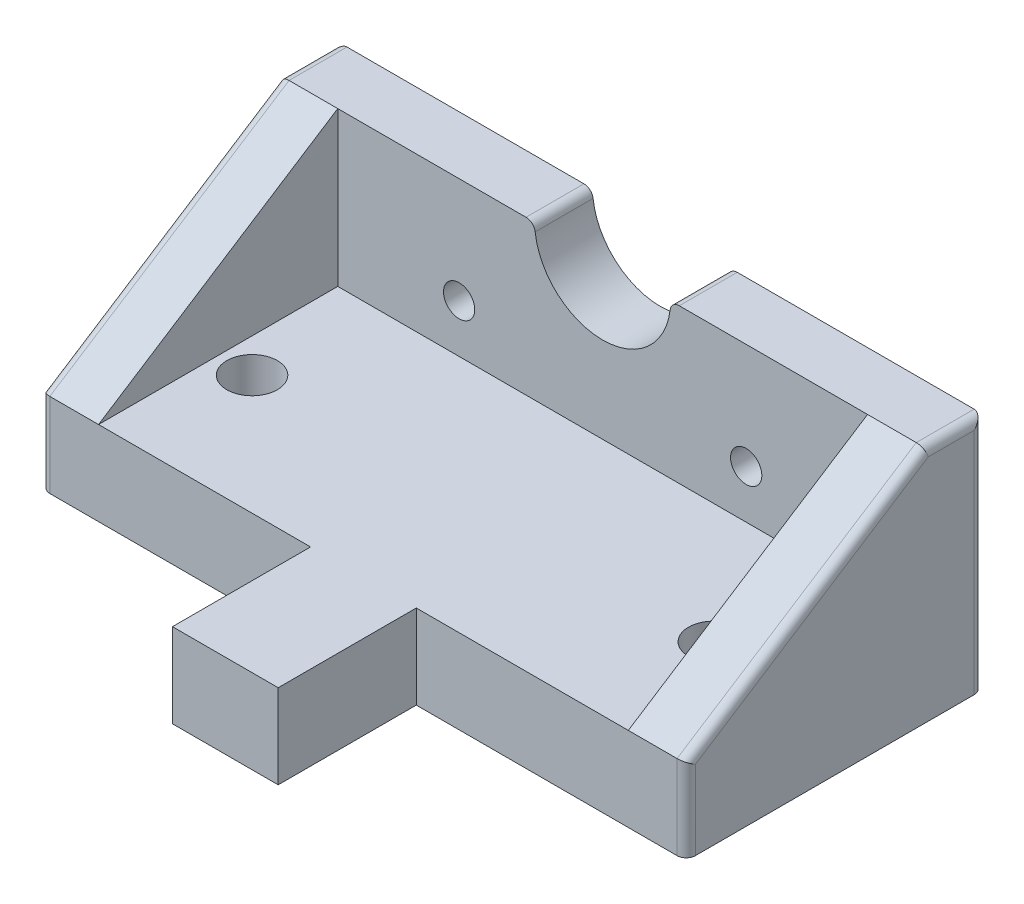
ISO-10303-21;
HEADER;
FILE_DESCRIPTION(('STEP AP214'),'2;1');
FILE_NAME('part.step','',(''),(''),'','','');
FILE_SCHEMA(('AUTOMOTIVE_DESIGN { 1 0 10303 214 1 1 1 1 }'));
ENDSEC;
DATA;
#1=APPLICATION_CONTEXT('core data for automotive mechanical design processes');
#2=APPLICATION_PROTOCOL_DEFINITION('international standard','automotive_design',2000,#1);
#3=PRODUCT_CONTEXT('',#1,'mechanical');
#4=PRODUCT('Part','Part','',(#3));
#5=PRODUCT_RELATED_PRODUCT_CATEGORY('part','',(#4));
#6=PRODUCT_DEFINITION_FORMATION('','',#4);
#7=PRODUCT_DEFINITION_CONTEXT('part definition',#1,'design');
#8=PRODUCT_DEFINITION('design','',#6,#7);
#9=PRODUCT_DEFINITION_SHAPE('','',#8);
#10=(LENGTH_UNIT() NAMED_UNIT(*) SI_UNIT(.MILLI.,.METRE.));
#11=(NAMED_UNIT(*) PLANE_ANGLE_UNIT() SI_UNIT($,.RADIAN.));
#12=(NAMED_UNIT(*) SI_UNIT($,.STERADIAN.) SOLID_ANGLE_UNIT());
#13=UNCERTAINTY_MEASURE_WITH_UNIT(LENGTH_MEASURE(1.E-05),#10,'distance_accuracy_value','');
#14=(GEOMETRIC_REPRESENTATION_CONTEXT(3) GLOBAL_UNCERTAINTY_ASSIGNED_CONTEXT((#13)) GLOBAL_UNIT_ASSIGNED_CONTEXT((#10,
#11,#12)) REPRESENTATION_CONTEXT('',''));
#15=CARTESIAN_POINT('',(0.,0.,0.));
#16=DIRECTION('',(0.,0.,1.));
#17=DIRECTION('',(1.,0.,0.));
#18=AXIS2_PLACEMENT_3D('',#15,#16,#17);
#19=CARTESIAN_POINT('',(-35.11,12.95,-47.34));
#20=DIRECTION('',(0.,1.,0.));
#21=DIRECTION('',(0.,0.,1.));
#22=AXIS2_PLACEMENT_3D('',#19,#20,#21);
#23=PLANE('',#22);
#24=DIRECTION('',(-1.,0.,0.));
#25=VECTOR('',#24,1.);
#26=CARTESIAN_POINT('',(-35.11,12.95,-47.34));
#27=LINE('',#26,#25);
#28=CARTESIAN_POINT('',(34.11,12.95,-47.34));
#29=VERTEX_POINT('',#28);
#30=CARTESIAN_POINT('',(8.33567625559448,12.95,-47.34));
#31=VERTEX_POINT('',#30);
#32=EDGE_CURVE('E255',#29,#31,#27,.T.);
#33=ORIENTED_EDGE('',*,*,#32,.T.);
#34=DIRECTION('',(0.,0.,-1.));
#35=VECTOR('',#34,1.);
#36=CARTESIAN_POINT('',(8.33567625559448,12.95,-47.34));
#37=LINE('',#36,#35);
#38=CARTESIAN_POINT('',(8.33567625559448,12.95,-41.04));
#39=VERTEX_POINT('',#38);
#40=EDGE_CURVE('E316',#31,#39,#37,.F.);
#41=ORIENTED_EDGE('',*,*,#40,.T.);
#42=DIRECTION('',(-1.,0.,0.));
#43=VECTOR('',#42,1.);
#44=CARTESIAN_POINT('',(-28.81,12.95,-41.04));
#45=LINE('',#44,#43);
#46=CARTESIAN_POINT('',(28.81,12.95,-41.04));
#47=VERTEX_POINT('',#46);
#48=EDGE_CURVE('E218',#47,#39,#45,.T.);
#49=ORIENTED_EDGE('',*,*,#48,.F.);
#50=DIRECTION('',(1.,0.,0.));
#51=VECTOR('',#50,1.);
#52=CARTESIAN_POINT('',(-35.11,12.95,-41.04));
#53=LINE('',#52,#51);
#54=CARTESIAN_POINT('',(34.11,12.95,-41.04));
#55=VERTEX_POINT('',#54);
#56=EDGE_CURVE('E183',#47,#55,#53,.T.);
#57=ORIENTED_EDGE('',*,*,#56,.T.);
#58=DIRECTION('',(0.,0.,1.));
#59=VECTOR('',#58,1.);
#60=CARTESIAN_POINT('',(34.11,12.95,-47.34));
#61=LINE('',#60,#59);
#62=EDGE_CURVE('E314',#55,#29,#61,.F.);
#63=ORIENTED_EDGE('',*,*,#62,.T.);
#64=EDGE_LOOP('',(#33,#41,#49,#57,#63));
#65=FACE_BOUND('',#64,.T.);
#66=ADVANCED_FACE('F32',(#65),#23,.T.);
#67=CARTESIAN_POINT('',(-8.33567625559447,12.95,-47.34));
#68=VERTEX_POINT('',#67);
#69=CARTESIAN_POINT('',(-34.11,12.95,-47.34));
#70=VERTEX_POINT('',#69);
#71=EDGE_CURVE('E259',#68,#70,#27,.T.);
#72=ORIENTED_EDGE('',*,*,#71,.T.);
#73=DIRECTION('',(0.,0.,1.));
#74=VECTOR('',#73,1.);
#75=CARTESIAN_POINT('',(-34.11,12.95,-47.34));
#76=LINE('',#75,#74);
#77=CARTESIAN_POINT('',(-34.11,12.95,-41.04));
#78=VERTEX_POINT('',#77);
#79=EDGE_CURVE('E295',#70,#78,#76,.T.);
#80=ORIENTED_EDGE('',*,*,#79,.T.);
#81=CARTESIAN_POINT('',(-28.81,12.95,-41.04));
#82=VERTEX_POINT('',#81);
#83=EDGE_CURVE('E383',#78,#82,#53,.T.);
#84=ORIENTED_EDGE('',*,*,#83,.T.);
#85=CARTESIAN_POINT('',(-8.33567625559447,12.95,-41.04));
#86=VERTEX_POINT('',#85);
#87=EDGE_CURVE('E221',#86,#82,#45,.T.);
#88=ORIENTED_EDGE('',*,*,#87,.F.);
#89=DIRECTION('',(0.,0.,-1.));
#90=VECTOR('',#89,1.);
#91=CARTESIAN_POINT('',(-8.33567625559447,12.95,-47.34));
#92=LINE('',#91,#90);
#93=EDGE_CURVE('E292',#86,#68,#92,.T.);
#94=ORIENTED_EDGE('',*,*,#93,.T.);
#95=EDGE_LOOP('',(#72,#80,#84,#88,#94));
#96=FACE_BOUND('',#95,.T.);
#97=ADVANCED_FACE('F444',(#96),#23,.T.);
#98=CARTESIAN_POINT('',(35.11,12.95,-47.34));
#99=DIRECTION('',(0.,0.,-1.));
#100=DIRECTION('',(-1.,0.,0.));
#101=AXIS2_PLACEMENT_3D('',#98,#99,#100);
#102=PLANE('',#101);
#103=CARTESIAN_POINT('',(15.61,1.45,-47.34));
#104=DIRECTION('',(0.,0.,-1.));
#105=DIRECTION('',(-1.,0.,0.));
#106=AXIS2_PLACEMENT_3D('',#103,#104,#105);
#107=CIRCLE('',#106,3.35);
#108=CARTESIAN_POINT('',(12.26,1.45,-47.34));
#109=VERTEX_POINT('',#108);
#110=EDGE_CURVE('E353',#109,#109,#107,.T.);
#111=ORIENTED_EDGE('',*,*,#110,.F.);
#112=EDGE_LOOP('',(#111));
#113=FACE_BOUND('',#112,.T.);
#114=CARTESIAN_POINT('',(-15.61,1.45,-47.34));
#115=DIRECTION('',(0.,0.,-1.));
#116=DIRECTION('',(-1.,0.,0.));
#117=AXIS2_PLACEMENT_3D('',#114,#115,#116);
#118=CIRCLE('',#117,3.35);
#119=CARTESIAN_POINT('',(-18.96,1.45,-47.34));
#120=VERTEX_POINT('',#119);
#121=EDGE_CURVE('E349',#120,#120,#118,.T.);
#122=ORIENTED_EDGE('',*,*,#121,.F.);
#123=EDGE_LOOP('',(#122));
#124=FACE_BOUND('',#123,.T.);
#125=DIRECTION('',(1.,0.,0.));
#126=VECTOR('',#125,1.);
#127=CARTESIAN_POINT('',(-35.11,-12.95,-47.34));
#128=LINE('',#127,#126);
#129=CARTESIAN_POINT('',(-34.11,-12.95,-47.34));
#130=VERTEX_POINT('',#129);
#131=CARTESIAN_POINT('',(34.11,-12.95,-47.34));
#132=VERTEX_POINT('',#131);
#133=EDGE_CURVE('E258',#130,#132,#128,.T.);
#134=ORIENTED_EDGE('',*,*,#133,.F.);
#135=DIRECTION('',(0.,-1.,0.));
#136=VECTOR('',#135,1.);
#137=CARTESIAN_POINT('',(-34.11,12.95,-47.34));
#138=LINE('',#137,#136);
#139=EDGE_CURVE('E303',#130,#70,#138,.F.);
#140=ORIENTED_EDGE('',*,*,#139,.T.);
#141=ORIENTED_EDGE('',*,*,#71,.F.);
#142=CARTESIAN_POINT('',(-8.33567625559447,11.95,-47.34));
#143=DIRECTION('',(0.,0.,-1.));
#144=DIRECTION('',(-1.,0.,0.));
#145=AXIS2_PLACEMENT_3D('',#142,#143,#144);
#146=CIRCLE('',#145,1.);
#147=CARTESIAN_POINT('',(-7.34279545608576,12.069112207464,-47.34));
#148=VERTEX_POINT('',#147);
#149=EDGE_CURVE('E301',#68,#148,#146,.T.);
#150=ORIENTED_EDGE('',*,*,#149,.T.);
#151=CARTESIAN_POINT('',(0.,12.95,-47.34));
#152=DIRECTION('',(0.,0.,-1.));
#153=DIRECTION('',(-1.,0.,0.));
#154=AXIS2_PLACEMENT_3D('',#151,#152,#153);
#155=CIRCLE('',#154,7.39544511256441);
#156=CARTESIAN_POINT('',(7.34279545608577,12.069112207464,-47.34));
#157=VERTEX_POINT('',#156);
#158=EDGE_CURVE('E197',#148,#157,#155,.F.);
#159=ORIENTED_EDGE('',*,*,#158,.T.);
#160=CARTESIAN_POINT('',(8.33567625559449,11.95,-47.34));
#161=DIRECTION('',(0.,0.,-1.));
#162=DIRECTION('',(-1.,0.,0.));
#163=AXIS2_PLACEMENT_3D('',#160,#161,#162);
#164=CIRCLE('',#163,1.);
#165=EDGE_CURVE('E299',#157,#31,#164,.T.);
#166=ORIENTED_EDGE('',*,*,#165,.T.);
#167=ORIENTED_EDGE('',*,*,#32,.F.);
#168=DIRECTION('',(0.,1.,0.));
#169=VECTOR('',#168,1.);
#170=CARTESIAN_POINT('',(34.11,12.95,-47.34));
#171=LINE('',#170,#169);
#172=EDGE_CURVE('E297',#29,#132,#171,.F.);
#173=ORIENTED_EDGE('',*,*,#172,.T.);
#174=EDGE_LOOP('',(#134,#140,#141,#150,#159,#166,#167,#173));
#175=FACE_BOUND('',#174,.T.);
#176=ADVANCED_FACE('F435',(#113,#124,#175),#102,.T.);
#177=CARTESIAN_POINT('',(-28.81,-3.8,-41.04));
#178=DIRECTION('',(0.,0.,-1.));
#179=DIRECTION('',(-1.,0.,0.));
#180=AXIS2_PLACEMENT_3D('',#177,#178,#179);
#181=PLANE('',#180);
#182=CARTESIAN_POINT('',(15.61,1.45,-41.04));
#183=DIRECTION('',(0.,0.,-1.));
#184=DIRECTION('',(-1.,0.,0.));
#185=AXIS2_PLACEMENT_3D('',#182,#183,#184);
#186=CIRCLE('',#185,1.7);
#187=CARTESIAN_POINT('',(13.91,1.45,-41.04));
#188=VERTEX_POINT('',#187);
#189=EDGE_CURVE('E347',#188,#188,#186,.T.);
#190=ORIENTED_EDGE('',*,*,#189,.T.);
#191=EDGE_LOOP('',(#190));
#192=FACE_BOUND('',#191,.T.);
#193=CARTESIAN_POINT('',(-15.61,1.45,-41.04));
#194=DIRECTION('',(0.,0.,-1.));
#195=DIRECTION('',(-1.,0.,0.));
#196=AXIS2_PLACEMENT_3D('',#193,#194,#195);
#197=CIRCLE('',#196,1.7);
#198=CARTESIAN_POINT('',(-17.31,1.45,-41.04));
#199=VERTEX_POINT('',#198);
#200=EDGE_CURVE('E339',#199,#199,#197,.T.);
#201=ORIENTED_EDGE('',*,*,#200,.T.);
#202=EDGE_LOOP('',(#201));
#203=FACE_BOUND('',#202,.T.);
#204=CARTESIAN_POINT('',(0.,12.95,-41.04));
#205=DIRECTION('',(0.,0.,-1.));
#206=DIRECTION('',(-1.,0.,0.));
#207=AXIS2_PLACEMENT_3D('',#204,#205,#206);
#208=CIRCLE('',#207,7.39544511256441);
#209=CARTESIAN_POINT('',(-7.34279545608576,12.069112207464,-41.04));
#210=VERTEX_POINT('',#209);
#211=CARTESIAN_POINT('',(7.34279545608577,12.069112207464,-41.04));
#212=VERTEX_POINT('',#211);
#213=EDGE_CURVE('E188',#210,#212,#208,.F.);
#214=ORIENTED_EDGE('',*,*,#213,.F.);
#215=CARTESIAN_POINT('',(-8.33567625559447,11.95,-41.04));
#216=DIRECTION('',(0.,0.,-1.));
#217=DIRECTION('',(-1.,0.,0.));
#218=AXIS2_PLACEMENT_3D('',#215,#216,#217);
#219=CIRCLE('',#218,1.);
#220=EDGE_CURVE('E312',#210,#86,#219,.F.);
#221=ORIENTED_EDGE('',*,*,#220,.T.);
#222=ORIENTED_EDGE('',*,*,#87,.T.);
#223=DIRECTION('',(0.,1.,0.));
#224=VECTOR('',#223,1.);
#225=CARTESIAN_POINT('',(-28.81,-3.8,-41.04));
#226=LINE('',#225,#224);
#227=CARTESIAN_POINT('',(-28.81,-3.8,-41.04));
#228=VERTEX_POINT('',#227);
#229=EDGE_CURVE('E222',#228,#82,#226,.T.);
#230=ORIENTED_EDGE('',*,*,#229,.F.);
#231=DIRECTION('',(-1.,0.,0.));
#232=VECTOR('',#231,1.);
#233=CARTESIAN_POINT('',(-28.81,-3.8,-41.04));
#234=LINE('',#233,#232);
#235=CARTESIAN_POINT('',(28.81,-3.8,-41.04));
#236=VERTEX_POINT('',#235);
#237=EDGE_CURVE('E210',#236,#228,#234,.T.);
#238=ORIENTED_EDGE('',*,*,#237,.F.);
#239=DIRECTION('',(0.,1.,0.));
#240=VECTOR('',#239,1.);
#241=CARTESIAN_POINT('',(28.81,-3.8,-41.04));
#242=LINE('',#241,#240);
#243=EDGE_CURVE('E208',#236,#47,#242,.T.);
#244=ORIENTED_EDGE('',*,*,#243,.T.);
#245=ORIENTED_EDGE('',*,*,#48,.T.);
#246=CARTESIAN_POINT('',(8.33567625559449,11.95,-41.04));
#247=DIRECTION('',(0.,0.,-1.));
#248=DIRECTION('',(-1.,0.,0.));
#249=AXIS2_PLACEMENT_3D('',#246,#247,#248);
#250=CIRCLE('',#249,1.);
#251=EDGE_CURVE('E310',#39,#212,#250,.F.);
#252=ORIENTED_EDGE('',*,*,#251,.T.);
#253=EDGE_LOOP('',(#214,#221,#222,#230,#238,#244,#245,#252));
#254=FACE_BOUND('',#253,.T.);
#255=ADVANCED_FACE('F425',(#192,#203,#254),#181,.F.);
#256=CARTESIAN_POINT('',(35.11,-12.95,-47.34));
#257=DIRECTION('',(1.,0.,0.));
#258=DIRECTION('',(0.,0.,-1.));
#259=AXIS2_PLACEMENT_3D('',#256,#257,#258);
#260=PLANE('',#259);
#261=DIRECTION('',(0.,0.,1.));
#262=VECTOR('',#261,1.);
#263=CARTESIAN_POINT('',(35.11,-12.95,-47.34));
#264=LINE('',#263,#262);
#265=CARTESIAN_POINT('',(35.11,-12.95,-46.34));
#266=VERTEX_POINT('',#265);
#267=CARTESIAN_POINT('',(35.11,-12.95,-16.02));
#268=VERTEX_POINT('',#267);
#269=EDGE_CURVE('E205',#266,#268,#264,.T.);
#270=ORIENTED_EDGE('',*,*,#269,.F.);
#271=DIRECTION('',(0.,1.,0.));
#272=VECTOR('',#271,1.);
#273=CARTESIAN_POINT('',(35.11,-12.95,-46.34));
#274=LINE('',#273,#272);
#275=CARTESIAN_POINT('',(35.11,11.95,-46.34));
#276=VERTEX_POINT('',#275);
#277=EDGE_CURVE('E324',#266,#276,#274,.T.);
#278=ORIENTED_EDGE('',*,*,#277,.T.);
#279=DIRECTION('',(0.,0.,1.));
#280=VECTOR('',#279,1.);
#281=CARTESIAN_POINT('',(35.11,11.95,-47.34));
#282=LINE('',#281,#280);
#283=CARTESIAN_POINT('',(35.11,11.95,-41.3340393765294));
#284=VERTEX_POINT('',#283);
#285=EDGE_CURVE('E322',#276,#284,#282,.T.);
#286=ORIENTED_EDGE('',*,*,#285,.T.);
#287=DIRECTION('',(0.,0.541280130393855,-0.84084232793123));
#288=VECTOR('',#287,1.);
#289=CARTESIAN_POINT('',(35.11,-4.64084232793124,-15.5612801303939));
#290=LINE('',#289,#288);
#291=CARTESIAN_POINT('',(35.11,-4.34554802293881,-16.02));
#292=VERTEX_POINT('',#291);
#293=EDGE_CURVE('E320',#284,#292,#290,.F.);
#294=ORIENTED_EDGE('',*,*,#293,.T.);
#295=DIRECTION('',(0.,1.,0.));
#296=VECTOR('',#295,1.);
#297=CARTESIAN_POINT('',(35.11,-12.95,-16.02));
#298=LINE('',#297,#296);
#299=EDGE_CURVE('E318',#292,#268,#298,.F.);
#300=ORIENTED_EDGE('',*,*,#299,.T.);
#301=EDGE_LOOP('',(#270,#278,#286,#294,#300));
#302=FACE_BOUND('',#301,.T.);
#303=ADVANCED_FACE('F489',(#302),#260,.T.);
#304=CARTESIAN_POINT('',(-35.11,-12.95,-47.34));
#305=DIRECTION('',(0.,-1.,0.));
#306=DIRECTION('',(0.,0.,-1.));
#307=AXIS2_PLACEMENT_3D('',#304,#305,#306);
#308=PLANE('',#307);
#309=CARTESIAN_POINT('',(-25.11,-12.95,-28.02));
#310=DIRECTION('',(0.,-1.,0.));
#311=DIRECTION('',(0.,0.,-1.));
#312=AXIS2_PLACEMENT_3D('',#309,#310,#311);
#313=CIRCLE('',#312,5.25);
#314=CARTESIAN_POINT('',(-25.11,-12.95,-33.27));
#315=VERTEX_POINT('',#314);
#316=EDGE_CURVE('E843',#315,#315,#313,.T.);
#317=ORIENTED_EDGE('',*,*,#316,.F.);
#318=EDGE_LOOP('',(#317));
#319=FACE_BOUND('',#318,.T.);
#320=CARTESIAN_POINT('',(25.11,-12.95,-28.02));
#321=DIRECTION('',(0.,-1.,0.));
#322=DIRECTION('',(0.,0.,-1.));
#323=AXIS2_PLACEMENT_3D('',#320,#321,#322);
#324=CIRCLE('',#323,5.25);
#325=CARTESIAN_POINT('',(25.11,-12.95,-33.27));
#326=VERTEX_POINT('',#325);
#327=EDGE_CURVE('E366',#326,#326,#324,.T.);
#328=ORIENTED_EDGE('',*,*,#327,.F.);
#329=EDGE_LOOP('',(#328));
#330=FACE_BOUND('',#329,.T.);
#331=DIRECTION('',(-1.,0.,0.));
#332=VECTOR('',#331,1.);
#333=CARTESIAN_POINT('',(-5.75,-12.95,-15.02));
#334=LINE('',#333,#332);
#335=CARTESIAN_POINT('',(-5.75,-12.95,-15.02));
#336=VERTEX_POINT('',#335);
#337=CARTESIAN_POINT('',(-34.11,-12.95,-15.02));
#338=VERTEX_POINT('',#337);
#339=EDGE_CURVE('E245',#336,#338,#334,.T.);
#340=ORIENTED_EDGE('',*,*,#339,.T.);
#341=CARTESIAN_POINT('',(-34.11,-12.95,-16.02));
#342=DIRECTION('',(0.,-1.,0.));
#343=DIRECTION('',(0.,0.,-1.));
#344=AXIS2_PLACEMENT_3D('',#341,#342,#343);
#345=CIRCLE('',#344,1.);
#346=CARTESIAN_POINT('',(-35.11,-12.95,-16.02));
#347=VERTEX_POINT('',#346);
#348=EDGE_CURVE('E288',#338,#347,#345,.T.);
#349=ORIENTED_EDGE('',*,*,#348,.T.);
#350=DIRECTION('',(0.,0.,1.));
#351=VECTOR('',#350,1.);
#352=CARTESIAN_POINT('',(-35.11,-12.95,-47.34));
#353=LINE('',#352,#351);
#354=CARTESIAN_POINT('',(-35.11,-12.95,-46.34));
#355=VERTEX_POINT('',#354);
#356=EDGE_CURVE('E262',#355,#347,#353,.T.);
#357=ORIENTED_EDGE('',*,*,#356,.F.);
#358=CARTESIAN_POINT('',(-34.11,-12.95,-46.34));
#359=DIRECTION('',(0.,-1.,0.));
#360=DIRECTION('',(0.,0.,-1.));
#361=AXIS2_PLACEMENT_3D('',#358,#359,#360);
#362=CIRCLE('',#361,1.);
#363=EDGE_CURVE('E286',#355,#130,#362,.T.);
#364=ORIENTED_EDGE('',*,*,#363,.T.);
#365=ORIENTED_EDGE('',*,*,#133,.T.);
#366=CARTESIAN_POINT('',(34.11,-12.95,-46.34));
#367=DIRECTION('',(0.,-1.,0.));
#368=DIRECTION('',(0.,0.,-1.));
#369=AXIS2_PLACEMENT_3D('',#366,#367,#368);
#370=CIRCLE('',#369,1.);
#371=EDGE_CURVE('E284',#132,#266,#370,.T.);
#372=ORIENTED_EDGE('',*,*,#371,.T.);
#373=ORIENTED_EDGE('',*,*,#269,.T.);
#374=CARTESIAN_POINT('',(34.11,-12.95,-16.02));
#375=DIRECTION('',(0.,-1.,0.));
#376=DIRECTION('',(0.,0.,-1.));
#377=AXIS2_PLACEMENT_3D('',#374,#375,#376);
#378=CIRCLE('',#377,1.);
#379=CARTESIAN_POINT('',(34.11,-12.95,-15.02));
#380=VERTEX_POINT('',#379);
#381=EDGE_CURVE('E282',#268,#380,#378,.T.);
#382=ORIENTED_EDGE('',*,*,#381,.T.);
#383=DIRECTION('',(1.,0.,0.));
#384=VECTOR('',#383,1.);
#385=CARTESIAN_POINT('',(5.75,-12.95,-15.02));
#386=LINE('',#385,#384);
#387=CARTESIAN_POINT('',(5.75,-12.95,-15.02));
#388=VERTEX_POINT('',#387);
#389=EDGE_CURVE('E235',#388,#380,#386,.T.);
#390=ORIENTED_EDGE('',*,*,#389,.F.);
#391=DIRECTION('',(0.,0.,-1.));
#392=VECTOR('',#391,1.);
#393=CARTESIAN_POINT('',(5.75,-12.95,-15.02));
#394=LINE('',#393,#392);
#395=CARTESIAN_POINT('',(5.75,-12.95,0.));
#396=VERTEX_POINT('',#395);
#397=EDGE_CURVE('E233',#396,#388,#394,.T.);
#398=ORIENTED_EDGE('',*,*,#397,.F.);
#399=DIRECTION('',(1.,0.,0.));
#400=VECTOR('',#399,1.);
#401=CARTESIAN_POINT('',(-35.11,-12.95,0.));
#402=LINE('',#401,#400);
#403=CARTESIAN_POINT('',(-5.75,-12.95,0.));
#404=VERTEX_POINT('',#403);
#405=EDGE_CURVE('E252',#404,#396,#402,.T.);
#406=ORIENTED_EDGE('',*,*,#405,.F.);
#407=DIRECTION('',(0.,0.,-1.));
#408=VECTOR('',#407,1.);
#409=CARTESIAN_POINT('',(-5.75,-12.95,-15.02));
#410=LINE('',#409,#408);
#411=EDGE_CURVE('E240',#404,#336,#410,.T.);
#412=ORIENTED_EDGE('',*,*,#411,.T.);
#413=EDGE_LOOP('',(#340,#349,#357,#364,#365,#372,#373,#382,#390,#398,#406,#412));
#414=FACE_BOUND('',#413,.T.);
#415=ADVANCED_FACE('F408',(#319,#330,#414),#308,.T.);
#416=CARTESIAN_POINT('',(35.11,12.95,0.));
#417=DIRECTION('',(0.,0.,-1.));
#418=DIRECTION('',(-1.,0.,0.));
#419=AXIS2_PLACEMENT_3D('',#416,#417,#418);
#420=PLANE('',#419);
#421=DIRECTION('',(0.,1.,0.));
#422=VECTOR('',#421,1.);
#423=CARTESIAN_POINT('',(5.75,-12.95,0.));
#424=LINE('',#423,#422);
#425=CARTESIAN_POINT('',(5.75,-3.8,0.));
#426=VERTEX_POINT('',#425);
#427=EDGE_CURVE('E237',#396,#426,#424,.T.);
#428=ORIENTED_EDGE('',*,*,#427,.T.);
#429=DIRECTION('',(1.,0.,0.));
#430=VECTOR('',#429,1.);
#431=CARTESIAN_POINT('',(-28.81,-3.8,0.));
#432=LINE('',#431,#430);
#433=CARTESIAN_POINT('',(-5.75,-3.8,0.));
#434=VERTEX_POINT('',#433);
#435=EDGE_CURVE('E211',#434,#426,#432,.T.);
#436=ORIENTED_EDGE('',*,*,#435,.F.);
#437=DIRECTION('',(0.,1.,0.));
#438=VECTOR('',#437,1.);
#439=CARTESIAN_POINT('',(-5.75,-12.95,0.));
#440=LINE('',#439,#438);
#441=EDGE_CURVE('E249',#404,#434,#440,.T.);
#442=ORIENTED_EDGE('',*,*,#441,.F.);
#443=ORIENTED_EDGE('',*,*,#405,.T.);
#444=EDGE_LOOP('',(#428,#436,#442,#443));
#445=FACE_BOUND('',#444,.T.);
#446=ADVANCED_FACE('F401',(#445),#420,.F.);
#447=CARTESIAN_POINT('',(-35.11,-12.95,-47.34));
#448=DIRECTION('',(-1.,0.,0.));
#449=DIRECTION('',(0.,0.,1.));
#450=AXIS2_PLACEMENT_3D('',#447,#448,#449);
#451=PLANE('',#450);
#452=ORIENTED_EDGE('',*,*,#356,.T.);
#453=DIRECTION('',(0.,1.,0.));
#454=VECTOR('',#453,1.);
#455=CARTESIAN_POINT('',(-35.11,-3.8,-16.02));
#456=LINE('',#455,#454);
#457=CARTESIAN_POINT('',(-35.11,-4.3455480229388,-16.02));
#458=VERTEX_POINT('',#457);
#459=EDGE_CURVE('E277',#347,#458,#456,.T.);
#460=ORIENTED_EDGE('',*,*,#459,.T.);
#461=DIRECTION('',(0.,0.541280130393855,-0.84084232793123));
#462=VECTOR('',#461,1.);
#463=CARTESIAN_POINT('',(-35.11,12.1091576720688,-41.5812801303938));
#464=LINE('',#463,#462);
#465=CARTESIAN_POINT('',(-35.11,11.95,-41.3340393765294));
#466=VERTEX_POINT('',#465);
#467=EDGE_CURVE('E275',#458,#466,#464,.T.);
#468=ORIENTED_EDGE('',*,*,#467,.T.);
#469=DIRECTION('',(0.,0.,1.));
#470=VECTOR('',#469,1.);
#471=CARTESIAN_POINT('',(-35.11,11.95,-47.34));
#472=LINE('',#471,#470);
#473=CARTESIAN_POINT('',(-35.11,11.95,-46.34));
#474=VERTEX_POINT('',#473);
#475=EDGE_CURVE('E273',#466,#474,#472,.F.);
#476=ORIENTED_EDGE('',*,*,#475,.T.);
#477=DIRECTION('',(0.,-1.,0.));
#478=VECTOR('',#477,1.);
#479=CARTESIAN_POINT('',(-35.11,-12.95,-46.34));
#480=LINE('',#479,#478);
#481=EDGE_CURVE('E271',#474,#355,#480,.T.);
#482=ORIENTED_EDGE('',*,*,#481,.T.);
#483=EDGE_LOOP('',(#452,#460,#468,#476,#482));
#484=FACE_BOUND('',#483,.T.);
#485=ADVANCED_FACE('F464',(#484),#451,.T.);
#486=CARTESIAN_POINT('',(-5.75,-12.95,-15.02));
#487=DIRECTION('',(1.,0.,0.));
#488=DIRECTION('',(0.,0.,-1.));
#489=AXIS2_PLACEMENT_3D('',#486,#487,#488);
#490=PLANE('',#489);
#491=ORIENTED_EDGE('',*,*,#441,.T.);
#492=DIRECTION('',(0.,0.,-1.));
#493=VECTOR('',#492,1.);
#494=CARTESIAN_POINT('',(-5.75,-3.8,-15.02));
#495=LINE('',#494,#493);
#496=CARTESIAN_POINT('',(-5.75,-3.8,-15.02));
#497=VERTEX_POINT('',#496);
#498=EDGE_CURVE('E230',#434,#497,#495,.T.);
#499=ORIENTED_EDGE('',*,*,#498,.T.);
#500=DIRECTION('',(0.,1.,0.));
#501=VECTOR('',#500,1.);
#502=CARTESIAN_POINT('',(-5.75,-12.95,-15.02));
#503=LINE('',#502,#501);
#504=EDGE_CURVE('E248',#336,#497,#503,.T.);
#505=ORIENTED_EDGE('',*,*,#504,.F.);
#506=ORIENTED_EDGE('',*,*,#411,.F.);
#507=EDGE_LOOP('',(#491,#499,#505,#506));
#508=FACE_BOUND('',#507,.T.);
#509=ADVANCED_FACE('F397',(#508),#490,.F.);
#510=CARTESIAN_POINT('',(-5.75,-12.95,-15.02));
#511=DIRECTION('',(0.,0.,-1.));
#512=DIRECTION('',(-1.,0.,0.));
#513=AXIS2_PLACEMENT_3D('',#510,#511,#512);
#514=PLANE('',#513);
#515=DIRECTION('',(1.,0.,0.));
#516=VECTOR('',#515,1.);
#517=CARTESIAN_POINT('',(-35.11,-3.8,-15.02));
#518=LINE('',#517,#516);
#519=CARTESIAN_POINT('',(-34.11,-3.8,-15.02));
#520=VERTEX_POINT('',#519);
#521=CARTESIAN_POINT('',(-28.81,-3.8,-15.02));
#522=VERTEX_POINT('',#521);
#523=EDGE_CURVE('E196',#520,#522,#518,.T.);
#524=ORIENTED_EDGE('',*,*,#523,.F.);
#525=DIRECTION('',(0.,1.,0.));
#526=VECTOR('',#525,1.);
#527=CARTESIAN_POINT('',(-34.11,-12.95,-15.02));
#528=LINE('',#527,#526);
#529=EDGE_CURVE('E280',#520,#338,#528,.F.);
#530=ORIENTED_EDGE('',*,*,#529,.T.);
#531=ORIENTED_EDGE('',*,*,#339,.F.);
#532=ORIENTED_EDGE('',*,*,#504,.T.);
#533=DIRECTION('',(-1.,0.,0.));
#534=VECTOR('',#533,1.);
#535=CARTESIAN_POINT('',(-5.75,-3.8,-15.02));
#536=LINE('',#535,#534);
#537=EDGE_CURVE('E227',#497,#522,#536,.T.);
#538=ORIENTED_EDGE('',*,*,#537,.T.);
#539=EDGE_LOOP('',(#524,#530,#531,#532,#538));
#540=FACE_BOUND('',#539,.T.);
#541=ADVANCED_FACE('F393',(#540),#514,.F.);
#542=CARTESIAN_POINT('',(5.75,-12.95,-15.02));
#543=DIRECTION('',(1.,0.,0.));
#544=DIRECTION('',(0.,0.,-1.));
#545=AXIS2_PLACEMENT_3D('',#542,#543,#544);
#546=PLANE('',#545);
#547=DIRECTION('',(0.,0.,-1.));
#548=VECTOR('',#547,1.);
#549=CARTESIAN_POINT('',(5.75,-3.8,-15.02));
#550=LINE('',#549,#548);
#551=CARTESIAN_POINT('',(5.75,-3.8,-15.02));
#552=VERTEX_POINT('',#551);
#553=EDGE_CURVE('E204',#426,#552,#550,.T.);
#554=ORIENTED_EDGE('',*,*,#553,.F.);
#555=ORIENTED_EDGE('',*,*,#427,.F.);
#556=ORIENTED_EDGE('',*,*,#397,.T.);
#557=DIRECTION('',(0.,1.,0.));
#558=VECTOR('',#557,1.);
#559=CARTESIAN_POINT('',(5.75,-12.95,-15.02));
#560=LINE('',#559,#558);
#561=EDGE_CURVE('E238',#388,#552,#560,.T.);
#562=ORIENTED_EDGE('',*,*,#561,.T.);
#563=EDGE_LOOP('',(#554,#555,#556,#562));
#564=FACE_BOUND('',#563,.T.);
#565=ADVANCED_FACE('F405',(#564),#546,.T.);
#566=CARTESIAN_POINT('',(5.75,-12.95,-15.02));
#567=DIRECTION('',(0.,0.,1.));
#568=DIRECTION('',(1.,0.,0.));
#569=AXIS2_PLACEMENT_3D('',#566,#567,#568);
#570=PLANE('',#569);
#571=ORIENTED_EDGE('',*,*,#389,.T.);
#572=DIRECTION('',(0.,1.,0.));
#573=VECTOR('',#572,1.);
#574=CARTESIAN_POINT('',(34.11,-12.95,-15.02));
#575=LINE('',#574,#573);
#576=CARTESIAN_POINT('',(34.11,-3.8,-15.02));
#577=VERTEX_POINT('',#576);
#578=EDGE_CURVE('E11',#380,#577,#575,.T.);
#579=ORIENTED_EDGE('',*,*,#578,.T.);
#580=CARTESIAN_POINT('',(28.81,-3.8,-15.02));
#581=VERTEX_POINT('',#580);
#582=EDGE_CURVE('E180',#581,#577,#518,.T.);
#583=ORIENTED_EDGE('',*,*,#582,.F.);
#584=DIRECTION('',(1.,0.,0.));
#585=VECTOR('',#584,1.);
#586=CARTESIAN_POINT('',(5.75,-3.8,-15.02));
#587=LINE('',#586,#585);
#588=EDGE_CURVE('E189',#552,#581,#587,.T.);
#589=ORIENTED_EDGE('',*,*,#588,.F.);
#590=ORIENTED_EDGE('',*,*,#561,.F.);
#591=EDGE_LOOP('',(#571,#579,#583,#589,#590));
#592=FACE_BOUND('',#591,.T.);
#593=ADVANCED_FACE('F193',(#592),#570,.T.);
#594=CARTESIAN_POINT('',(-28.81,-3.8,0.));
#595=DIRECTION('',(-1.,0.,0.));
#596=DIRECTION('',(0.,0.,1.));
#597=AXIS2_PLACEMENT_3D('',#594,#595,#596);
#598=PLANE('',#597);
#599=ORIENTED_EDGE('',*,*,#229,.T.);
#600=DIRECTION('',(0.,-0.541280130393855,0.84084232793123));
#601=VECTOR('',#600,1.);
#602=CARTESIAN_POINT('',(-28.81,-10.6360712984474,-4.40062237697902));
#603=LINE('',#602,#601);
#604=EDGE_CURVE('E385',#82,#522,#603,.T.);
#605=ORIENTED_EDGE('',*,*,#604,.T.);
#606=DIRECTION('',(0.,0.,1.));
#607=VECTOR('',#606,1.);
#608=CARTESIAN_POINT('',(-28.81,-3.8,0.));
#609=LINE('',#608,#607);
#610=EDGE_CURVE('E214',#228,#522,#609,.T.);
#611=ORIENTED_EDGE('',*,*,#610,.F.);
#612=EDGE_LOOP('',(#599,#605,#611));
#613=FACE_BOUND('',#612,.T.);
#614=ADVANCED_FACE('F448',(#613),#598,.F.);
#615=CARTESIAN_POINT('',(-28.81,-3.8,-41.04));
#616=DIRECTION('',(0.,-1.,0.));
#617=DIRECTION('',(0.,0.,-1.));
#618=AXIS2_PLACEMENT_3D('',#615,#616,#617);
#619=PLANE('',#618);
#620=CARTESIAN_POINT('',(-25.11,-3.8,-28.02));
#621=DIRECTION('',(0.,-1.,0.));
#622=DIRECTION('',(0.,0.,-1.));
#623=AXIS2_PLACEMENT_3D('',#620,#621,#622);
#624=CIRCLE('',#623,2.75);
#625=CARTESIAN_POINT('',(-25.11,-3.8,-30.77));
#626=VERTEX_POINT('',#625);
#627=EDGE_CURVE('E36',#626,#626,#624,.T.);
#628=ORIENTED_EDGE('',*,*,#627,.T.);
#629=EDGE_LOOP('',(#628));
#630=FACE_BOUND('',#629,.T.);
#631=CARTESIAN_POINT('',(25.11,-3.8,-28.02));
#632=DIRECTION('',(0.,-1.,0.));
#633=DIRECTION('',(0.,0.,-1.));
#634=AXIS2_PLACEMENT_3D('',#631,#632,#633);
#635=CIRCLE('',#634,2.75);
#636=CARTESIAN_POINT('',(25.11,-3.8,-30.77));
#637=VERTEX_POINT('',#636);
#638=EDGE_CURVE('E351',#637,#637,#635,.T.);
#639=ORIENTED_EDGE('',*,*,#638,.T.);
#640=EDGE_LOOP('',(#639));
#641=FACE_BOUND('',#640,.T.);
#642=ORIENTED_EDGE('',*,*,#537,.F.);
#643=ORIENTED_EDGE('',*,*,#498,.F.);
#644=ORIENTED_EDGE('',*,*,#435,.T.);
#645=ORIENTED_EDGE('',*,*,#553,.T.);
#646=ORIENTED_EDGE('',*,*,#588,.T.);
#647=DIRECTION('',(0.,0.,-1.));
#648=VECTOR('',#647,1.);
#649=CARTESIAN_POINT('',(28.81,-3.8,0.));
#650=LINE('',#649,#648);
#651=EDGE_CURVE('E202',#581,#236,#650,.T.);
#652=ORIENTED_EDGE('',*,*,#651,.T.);
#653=ORIENTED_EDGE('',*,*,#237,.T.);
#654=ORIENTED_EDGE('',*,*,#610,.T.);
#655=EDGE_LOOP('',(#642,#643,#644,#645,#646,#652,#653,#654));
#656=FACE_BOUND('',#655,.T.);
#657=ADVANCED_FACE('F200',(#630,#641,#656),#619,.F.);
#658=CARTESIAN_POINT('',(28.81,-3.8,0.));
#659=DIRECTION('',(1.,0.,0.));
#660=DIRECTION('',(0.,0.,-1.));
#661=AXIS2_PLACEMENT_3D('',#658,#659,#660);
#662=PLANE('',#661);
#663=ORIENTED_EDGE('',*,*,#651,.F.);
#664=DIRECTION('',(0.,0.541280130393855,-0.84084232793123));
#665=VECTOR('',#664,1.);
#666=CARTESIAN_POINT('',(28.81,-10.6360712984474,-4.40062237697902));
#667=LINE('',#666,#665);
#668=EDGE_CURVE('E178',#581,#47,#667,.T.);
#669=ORIENTED_EDGE('',*,*,#668,.T.);
#670=ORIENTED_EDGE('',*,*,#243,.F.);
#671=EDGE_LOOP('',(#663,#669,#670));
#672=FACE_BOUND('',#671,.T.);
#673=ADVANCED_FACE('F207',(#672),#662,.F.);
#674=CARTESIAN_POINT('',(-35.11,-3.8,-15.02));
#675=DIRECTION('',(0.,-0.84084232793123,-0.541280130393855));
#676=DIRECTION('',(0.,0.541280130393855,-0.84084232793123));
#677=AXIS2_PLACEMENT_3D('',#674,#675,#676);
#678=PLANE('',#677);
#679=ORIENTED_EDGE('',*,*,#582,.T.);
#680=DIRECTION('',(0.,0.541280130393855,-0.84084232793123));
#681=VECTOR('',#680,1.);
#682=CARTESIAN_POINT('',(34.11,12.95,-41.04));
#683=LINE('',#682,#681);
#684=EDGE_CURVE('E41',#577,#55,#683,.T.);
#685=ORIENTED_EDGE('',*,*,#684,.T.);
#686=ORIENTED_EDGE('',*,*,#56,.F.);
#687=ORIENTED_EDGE('',*,*,#668,.F.);
#688=EDGE_LOOP('',(#679,#685,#686,#687));
#689=FACE_BOUND('',#688,.T.);
#690=ADVANCED_FACE('F179',(#689),#678,.F.);
#691=ORIENTED_EDGE('',*,*,#83,.F.);
#692=DIRECTION('',(0.,0.541280130393855,-0.84084232793123));
#693=VECTOR('',#692,1.);
#694=CARTESIAN_POINT('',(-34.11,-3.8,-15.02));
#695=LINE('',#694,#693);
#696=EDGE_CURVE('E290',#78,#520,#695,.F.);
#697=ORIENTED_EDGE('',*,*,#696,.T.);
#698=ORIENTED_EDGE('',*,*,#523,.T.);
#699=ORIENTED_EDGE('',*,*,#604,.F.);
#700=EDGE_LOOP('',(#691,#697,#698,#699));
#701=FACE_BOUND('',#700,.T.);
#702=ADVANCED_FACE('F450',(#701),#678,.F.);
#703=CARTESIAN_POINT('',(0.,12.95,102.184014787847));
#704=DIRECTION('',(0.,0.,-1.));
#705=DIRECTION('',(-1.,0.,0.));
#706=AXIS2_PLACEMENT_3D('',#703,#704,#705);
#707=CYLINDRICAL_SURFACE('',#706,7.39544511256441);
#708=ORIENTED_EDGE('',*,*,#158,.F.);
#709=DIRECTION('',(0.,0.,-1.));
#710=VECTOR('',#709,1.);
#711=CARTESIAN_POINT('',(-7.34279545608576,12.069112207464,102.184014787847));
#712=LINE('',#711,#710);
#713=EDGE_CURVE('E308',#148,#210,#712,.F.);
#714=ORIENTED_EDGE('',*,*,#713,.T.);
#715=ORIENTED_EDGE('',*,*,#213,.T.);
#716=DIRECTION('',(0.,0.,-1.));
#717=VECTOR('',#716,1.);
#718=CARTESIAN_POINT('',(7.34279545608577,12.069112207464,102.184014787847));
#719=LINE('',#718,#717);
#720=EDGE_CURVE('E305',#212,#157,#719,.T.);
#721=ORIENTED_EDGE('',*,*,#720,.T.);
#722=EDGE_LOOP('',(#708,#714,#715,#721));
#723=FACE_BOUND('',#722,.T.);
#724=ADVANCED_FACE('F431',(#723),#707,.F.);
#725=CARTESIAN_POINT('',(-34.11,-12.95,-46.34));
#726=DIRECTION('',(0.,-1.,0.));
#727=DIRECTION('',(0.,0.,-1.));
#728=AXIS2_PLACEMENT_3D('',#725,#726,#727);
#729=CYLINDRICAL_SURFACE('',#728,1.);
#730=ORIENTED_EDGE('',*,*,#363,.F.);
#731=ORIENTED_EDGE('',*,*,#481,.F.);
#732=CARTESIAN_POINT('',(-34.11,11.95,-46.34));
#733=DIRECTION('',(0.,-0.707106781186547,-0.707106781186547));
#734=DIRECTION('',(0.,-0.707106781186547,0.707106781186547));
#735=AXIS2_PLACEMENT_3D('',#732,#733,#734);
#736=ELLIPSE('',#735,1.41421356237309,1.);
#737=EDGE_CURVE('E334',#70,#474,#736,.F.);
#738=ORIENTED_EDGE('',*,*,#737,.F.);
#739=ORIENTED_EDGE('',*,*,#139,.F.);
#740=EDGE_LOOP('',(#730,#731,#738,#739));
#741=FACE_BOUND('',#740,.T.);
#742=ADVANCED_FACE('F468',(#741),#729,.T.);
#743=CARTESIAN_POINT('',(-34.11,11.95,-47.34));
#744=DIRECTION('',(0.,0.,1.));
#745=DIRECTION('',(1.,0.,0.));
#746=AXIS2_PLACEMENT_3D('',#743,#744,#745);
#747=CYLINDRICAL_SURFACE('',#746,1.);
#748=ORIENTED_EDGE('',*,*,#737,.T.);
#749=ORIENTED_EDGE('',*,*,#475,.F.);
#750=CARTESIAN_POINT('',(-34.11,11.95,-41.3340393765294));
#751=DIRECTION('',(0.,-0.282097210256296,0.95938582643565));
#752=DIRECTION('',(0.,0.95938582643565,0.282097210256296));
#753=AXIS2_PLACEMENT_3D('',#750,#751,#752);
#754=ELLIPSE('',#753,1.0423335142601,1.);
#755=EDGE_CURVE('E330',#78,#466,#754,.T.);
#756=ORIENTED_EDGE('',*,*,#755,.F.);
#757=ORIENTED_EDGE('',*,*,#79,.F.);
#758=EDGE_LOOP('',(#748,#749,#756,#757));
#759=FACE_BOUND('',#758,.T.);
#760=ADVANCED_FACE('F472',(#759),#747,.T.);
#761=CARTESIAN_POINT('',(-34.11,7.3881942643765,-34.2475805561758));
#762=DIRECTION('',(0.,-0.541280130393855,0.84084232793123));
#763=DIRECTION('',(0.,-0.84084232793123,-0.541280130393855));
#764=AXIS2_PLACEMENT_3D('',#761,#762,#763);
#765=CYLINDRICAL_SURFACE('',#764,1.);
#766=ORIENTED_EDGE('',*,*,#755,.T.);
#767=ORIENTED_EDGE('',*,*,#467,.F.);
#768=CARTESIAN_POINT('',(-34.11,-4.34554802293881,-16.02));
#769=DIRECTION('',(0.,-0.877861073972942,0.478915373320874));
#770=DIRECTION('',(0.,0.478915373320874,0.877861073972942));
#771=AXIS2_PLACEMENT_3D('',#768,#769,#770);
#772=ELLIPSE('',#771,1.13913240904314,1.);
#773=EDGE_CURVE('E328',#520,#458,#772,.T.);
#774=ORIENTED_EDGE('',*,*,#773,.F.);
#775=ORIENTED_EDGE('',*,*,#696,.F.);
#776=EDGE_LOOP('',(#766,#767,#774,#775));
#777=FACE_BOUND('',#776,.T.);
#778=ADVANCED_FACE('F455',(#777),#765,.T.);
#779=CARTESIAN_POINT('',(-34.11,-12.95,-16.02));
#780=DIRECTION('',(0.,-1.,0.));
#781=DIRECTION('',(0.,0.,-1.));
#782=AXIS2_PLACEMENT_3D('',#779,#780,#781);
#783=CYLINDRICAL_SURFACE('',#782,1.);
#784=ORIENTED_EDGE('',*,*,#348,.F.);
#785=ORIENTED_EDGE('',*,*,#529,.F.);
#786=ORIENTED_EDGE('',*,*,#773,.T.);
#787=ORIENTED_EDGE('',*,*,#459,.F.);
#788=EDGE_LOOP('',(#784,#785,#786,#787));
#789=FACE_BOUND('',#788,.T.);
#790=ADVANCED_FACE('F460',(#789),#783,.T.);
#791=CARTESIAN_POINT('',(-8.33567625559447,11.95,102.184014787847));
#792=DIRECTION('',(0.,0.,-1.));
#793=DIRECTION('',(-1.,0.,0.));
#794=AXIS2_PLACEMENT_3D('',#791,#792,#793);
#795=CYLINDRICAL_SURFACE('',#794,1.);
#796=ORIENTED_EDGE('',*,*,#220,.F.);
#797=ORIENTED_EDGE('',*,*,#713,.F.);
#798=ORIENTED_EDGE('',*,*,#149,.F.);
#799=ORIENTED_EDGE('',*,*,#93,.F.);
#800=EDGE_LOOP('',(#796,#797,#798,#799));
#801=FACE_BOUND('',#800,.T.);
#802=ADVANCED_FACE('F441',(#801),#795,.T.);
#803=CARTESIAN_POINT('',(8.33567625559449,11.95,102.184014787847));
#804=DIRECTION('',(0.,0.,-1.));
#805=DIRECTION('',(-1.,0.,0.));
#806=AXIS2_PLACEMENT_3D('',#803,#804,#805);
#807=CYLINDRICAL_SURFACE('',#806,1.);
#808=ORIENTED_EDGE('',*,*,#251,.F.);
#809=ORIENTED_EDGE('',*,*,#40,.F.);
#810=ORIENTED_EDGE('',*,*,#165,.F.);
#811=ORIENTED_EDGE('',*,*,#720,.F.);
#812=EDGE_LOOP('',(#808,#809,#810,#811));
#813=FACE_BOUND('',#812,.T.);
#814=ADVANCED_FACE('F428',(#813),#807,.T.);
#815=CARTESIAN_POINT('',(34.11,-12.95,-16.02));
#816=DIRECTION('',(0.,1.,0.));
#817=DIRECTION('',(0.,0.,1.));
#818=AXIS2_PLACEMENT_3D('',#815,#816,#817);
#819=CYLINDRICAL_SURFACE('',#818,1.);
#820=ORIENTED_EDGE('',*,*,#381,.F.);
#821=ORIENTED_EDGE('',*,*,#299,.F.);
#822=CARTESIAN_POINT('',(34.11,-4.34554802293881,-16.02));
#823=DIRECTION('',(0.,0.877861073972942,-0.478915373320874));
#824=DIRECTION('',(0.,0.478915373320874,0.877861073972942));
#825=AXIS2_PLACEMENT_3D('',#822,#823,#824);
#826=ELLIPSE('',#825,1.13913240904314,1.);
#827=EDGE_CURVE('E331',#577,#292,#826,.T.);
#828=ORIENTED_EDGE('',*,*,#827,.F.);
#829=ORIENTED_EDGE('',*,*,#578,.F.);
#830=EDGE_LOOP('',(#820,#821,#828,#829));
#831=FACE_BOUND('',#830,.T.);
#832=ADVANCED_FACE('F34',(#831),#819,.T.);
#833=CARTESIAN_POINT('',(34.11,-4.64084232793124,-15.5612801303939));
#834=DIRECTION('',(0.,-0.541280130393855,0.84084232793123));
#835=DIRECTION('',(0.,-0.84084232793123,-0.541280130393855));
#836=AXIS2_PLACEMENT_3D('',#833,#834,#835);
#837=CYLINDRICAL_SURFACE('',#836,1.);
#838=ORIENTED_EDGE('',*,*,#827,.T.);
#839=ORIENTED_EDGE('',*,*,#293,.F.);
#840=CARTESIAN_POINT('',(34.11,11.95,-41.3340393765294));
#841=DIRECTION('',(0.,-0.282097210256296,0.95938582643565));
#842=DIRECTION('',(0.,-0.95938582643565,-0.282097210256296));
#843=AXIS2_PLACEMENT_3D('',#840,#841,#842);
#844=ELLIPSE('',#843,1.0423335142601,1.);
#845=EDGE_CURVE('E338',#55,#284,#844,.F.);
#846=ORIENTED_EDGE('',*,*,#845,.F.);
#847=ORIENTED_EDGE('',*,*,#684,.F.);
#848=EDGE_LOOP('',(#838,#839,#846,#847));
#849=FACE_BOUND('',#848,.T.);
#850=ADVANCED_FACE('F416',(#849),#837,.T.);
#851=CARTESIAN_POINT('',(34.11,11.95,-47.34));
#852=DIRECTION('',(0.,0.,1.));
#853=DIRECTION('',(1.,0.,0.));
#854=AXIS2_PLACEMENT_3D('',#851,#852,#853);
#855=CYLINDRICAL_SURFACE('',#854,1.);
#856=ORIENTED_EDGE('',*,*,#845,.T.);
#857=ORIENTED_EDGE('',*,*,#285,.F.);
#858=CARTESIAN_POINT('',(34.11,11.95,-46.34));
#859=DIRECTION('',(0.,0.707106781186547,0.707106781186547));
#860=DIRECTION('',(0.,-0.707106781186547,0.707106781186547));
#861=AXIS2_PLACEMENT_3D('',#858,#859,#860);
#862=ELLIPSE('',#861,1.41421356237309,1.);
#863=EDGE_CURVE('E55',#29,#276,#862,.F.);
#864=ORIENTED_EDGE('',*,*,#863,.F.);
#865=ORIENTED_EDGE('',*,*,#62,.F.);
#866=EDGE_LOOP('',(#856,#857,#864,#865));
#867=FACE_BOUND('',#866,.T.);
#868=ADVANCED_FACE('F507',(#867),#855,.T.);
#869=CARTESIAN_POINT('',(34.11,-12.95,-46.34));
#870=DIRECTION('',(0.,1.,0.));
#871=DIRECTION('',(0.,0.,1.));
#872=AXIS2_PLACEMENT_3D('',#869,#870,#871);
#873=CYLINDRICAL_SURFACE('',#872,1.);
#874=ORIENTED_EDGE('',*,*,#371,.F.);
#875=ORIENTED_EDGE('',*,*,#172,.F.);
#876=ORIENTED_EDGE('',*,*,#863,.T.);
#877=ORIENTED_EDGE('',*,*,#277,.F.);
#878=EDGE_LOOP('',(#874,#875,#876,#877));
#879=FACE_BOUND('',#878,.T.);
#880=ADVANCED_FACE('F503',(#879),#873,.T.);
#881=CARTESIAN_POINT('',(-15.61,1.45,-47.34));
#882=DIRECTION('',(0.,0.,-1.));
#883=DIRECTION('',(-1.,0.,0.));
#884=AXIS2_PLACEMENT_3D('',#881,#882,#883);
#885=CYLINDRICAL_SURFACE('',#884,1.7);
#886=CARTESIAN_POINT('',(-15.61,1.45,-45.69));
#887=DIRECTION('',(0.,0.,-1.));
#888=DIRECTION('',(-1.,0.,0.));
#889=AXIS2_PLACEMENT_3D('',#886,#887,#888);
#890=CIRCLE('',#889,1.70000000000001);
#891=CARTESIAN_POINT('',(-17.31,1.45,-45.69));
#892=VERTEX_POINT('',#891);
#893=EDGE_CURVE('E346',#892,#892,#890,.T.);
#894=ORIENTED_EDGE('',*,*,#893,.T.);
#895=EDGE_LOOP('',(#894));
#896=FACE_BOUND('',#895,.T.);
#897=ORIENTED_EDGE('',*,*,#200,.F.);
#898=EDGE_LOOP('',(#897));
#899=FACE_BOUND('',#898,.T.);
#900=ADVANCED_FACE('F506',(#896,#899),#885,.F.);
#901=CARTESIAN_POINT('',(-13.91,1.45,-45.69));
#902=DIRECTION('',(0.,0.,1.));
#903=DIRECTION('',(1.,0.,0.));
#904=AXIS2_PLACEMENT_3D('',#901,#902,#903);
#905=PLANE('',#904);
#906=ORIENTED_EDGE('',*,*,#893,.F.);
#907=EDGE_LOOP('',(#906));
#908=FACE_BOUND('',#907,.T.);
#909=CARTESIAN_POINT('',(-15.61,1.45,-45.69));
#910=DIRECTION('',(0.,0.,-1.));
#911=DIRECTION('',(-1.,0.,0.));
#912=AXIS2_PLACEMENT_3D('',#909,#910,#911);
#913=CIRCLE('',#912,3.35);
#914=CARTESIAN_POINT('',(-18.96,1.45,-45.69));
#915=VERTEX_POINT('',#914);
#916=EDGE_CURVE('E376',#915,#915,#913,.T.);
#917=ORIENTED_EDGE('',*,*,#916,.T.);
#918=EDGE_LOOP('',(#917));
#919=FACE_BOUND('',#918,.T.);
#920=ADVANCED_FACE('F752',(#908,#919),#905,.F.);
#921=CARTESIAN_POINT('',(-15.61,1.45,-47.34));
#922=DIRECTION('',(0.,0.,-1.));
#923=DIRECTION('',(-1.,0.,0.));
#924=AXIS2_PLACEMENT_3D('',#921,#922,#923);
#925=CYLINDRICAL_SURFACE('',#924,3.35);
#926=ORIENTED_EDGE('',*,*,#916,.F.);
#927=EDGE_LOOP('',(#926));
#928=FACE_BOUND('',#927,.T.);
#929=ORIENTED_EDGE('',*,*,#121,.T.);
#930=EDGE_LOOP('',(#929));
#931=FACE_BOUND('',#930,.T.);
#932=ADVANCED_FACE('F748',(#928,#931),#925,.F.);
#933=CARTESIAN_POINT('',(15.61,1.45,-47.34));
#934=DIRECTION('',(0.,0.,-1.));
#935=DIRECTION('',(-1.,0.,0.));
#936=AXIS2_PLACEMENT_3D('',#933,#934,#935);
#937=CYLINDRICAL_SURFACE('',#936,1.7);
#938=CARTESIAN_POINT('',(15.61,1.45,-45.69));
#939=DIRECTION('',(0.,0.,-1.));
#940=DIRECTION('',(-1.,0.,0.));
#941=AXIS2_PLACEMENT_3D('',#938,#939,#940);
#942=CIRCLE('',#941,1.70000000000001);
#943=CARTESIAN_POINT('',(13.91,1.45,-45.69));
#944=VERTEX_POINT('',#943);
#945=EDGE_CURVE('E350',#944,#944,#942,.T.);
#946=ORIENTED_EDGE('',*,*,#945,.T.);
#947=EDGE_LOOP('',(#946));
#948=FACE_BOUND('',#947,.T.);
#949=ORIENTED_EDGE('',*,*,#189,.F.);
#950=EDGE_LOOP('',(#949));
#951=FACE_BOUND('',#950,.T.);
#952=ADVANCED_FACE('F744',(#948,#951),#937,.F.);
#953=CARTESIAN_POINT('',(17.31,1.45,-45.69));
#954=DIRECTION('',(0.,0.,1.));
#955=DIRECTION('',(1.,0.,0.));
#956=AXIS2_PLACEMENT_3D('',#953,#954,#955);
#957=PLANE('',#956);
#958=ORIENTED_EDGE('',*,*,#945,.F.);
#959=EDGE_LOOP('',(#958));
#960=FACE_BOUND('',#959,.T.);
#961=CARTESIAN_POINT('',(15.61,1.45,-45.69));
#962=DIRECTION('',(0.,0.,-1.));
#963=DIRECTION('',(-1.,0.,0.));
#964=AXIS2_PLACEMENT_3D('',#961,#962,#963);
#965=CIRCLE('',#964,3.35);
#966=CARTESIAN_POINT('',(12.26,1.45,-45.69));
#967=VERTEX_POINT('',#966);
#968=EDGE_CURVE('E358',#967,#967,#965,.T.);
#969=ORIENTED_EDGE('',*,*,#968,.T.);
#970=EDGE_LOOP('',(#969));
#971=FACE_BOUND('',#970,.T.);
#972=ADVANCED_FACE('F740',(#960,#971),#957,.F.);
#973=CARTESIAN_POINT('',(15.61,1.45,-47.34));
#974=DIRECTION('',(0.,0.,-1.));
#975=DIRECTION('',(-1.,0.,0.));
#976=AXIS2_PLACEMENT_3D('',#973,#974,#975);
#977=CYLINDRICAL_SURFACE('',#976,3.35);
#978=ORIENTED_EDGE('',*,*,#968,.F.);
#979=EDGE_LOOP('',(#978));
#980=FACE_BOUND('',#979,.T.);
#981=ORIENTED_EDGE('',*,*,#110,.T.);
#982=EDGE_LOOP('',(#981));
#983=FACE_BOUND('',#982,.T.);
#984=ADVANCED_FACE('F666',(#980,#983),#977,.F.);
#985=CARTESIAN_POINT('',(25.11,-12.95,-28.02));
#986=DIRECTION('',(0.,-1.,0.));
#987=DIRECTION('',(0.,0.,-1.));
#988=AXIS2_PLACEMENT_3D('',#985,#986,#987);
#989=CYLINDRICAL_SURFACE('',#988,2.75);
#990=CARTESIAN_POINT('',(25.11,-10.2,-28.02));
#991=DIRECTION('',(0.,-1.,0.));
#992=DIRECTION('',(0.,0.,-1.));
#993=AXIS2_PLACEMENT_3D('',#990,#991,#992);
#994=CIRCLE('',#993,2.75);
#995=CARTESIAN_POINT('',(25.11,-10.2,-30.77));
#996=VERTEX_POINT('',#995);
#997=EDGE_CURVE('E354',#996,#996,#994,.T.);
#998=ORIENTED_EDGE('',*,*,#997,.T.);
#999=EDGE_LOOP('',(#998));
#1000=FACE_BOUND('',#999,.T.);
#1001=ORIENTED_EDGE('',*,*,#638,.F.);
#1002=EDGE_LOOP('',(#1001));
#1003=FACE_BOUND('',#1002,.T.);
#1004=ADVANCED_FACE('F678',(#1000,#1003),#989,.F.);
#1005=CARTESIAN_POINT('',(27.86,-10.2,-28.02));
#1006=DIRECTION('',(0.,1.,0.));
#1007=DIRECTION('',(0.,0.,1.));
#1008=AXIS2_PLACEMENT_3D('',#1005,#1006,#1007);
#1009=PLANE('',#1008);
#1010=ORIENTED_EDGE('',*,*,#997,.F.);
#1011=EDGE_LOOP('',(#1010));
#1012=FACE_BOUND('',#1011,.T.);
#1013=CARTESIAN_POINT('',(25.11,-10.2,-28.02));
#1014=DIRECTION('',(0.,-1.,0.));
#1015=DIRECTION('',(0.,0.,-1.));
#1016=AXIS2_PLACEMENT_3D('',#1013,#1014,#1015);
#1017=CIRCLE('',#1016,5.25);
#1018=CARTESIAN_POINT('',(25.11,-10.2,-33.27));
#1019=VERTEX_POINT('',#1018);
#1020=EDGE_CURVE('E361',#1019,#1019,#1017,.T.);
#1021=ORIENTED_EDGE('',*,*,#1020,.T.);
#1022=EDGE_LOOP('',(#1021));
#1023=FACE_BOUND('',#1022,.T.);
#1024=ADVANCED_FACE('F683',(#1012,#1023),#1009,.F.);
#1025=CARTESIAN_POINT('',(25.11,-12.95,-28.02));
#1026=DIRECTION('',(0.,-1.,0.));
#1027=DIRECTION('',(0.,0.,-1.));
#1028=AXIS2_PLACEMENT_3D('',#1025,#1026,#1027);
#1029=CYLINDRICAL_SURFACE('',#1028,5.25);
#1030=ORIENTED_EDGE('',*,*,#1020,.F.);
#1031=EDGE_LOOP('',(#1030));
#1032=FACE_BOUND('',#1031,.T.);
#1033=ORIENTED_EDGE('',*,*,#327,.T.);
#1034=EDGE_LOOP('',(#1033));
#1035=FACE_BOUND('',#1034,.T.);
#1036=ADVANCED_FACE('F692',(#1032,#1035),#1029,.F.);
#1037=CARTESIAN_POINT('',(-25.11,-12.95,-28.02));
#1038=DIRECTION('',(0.,-1.,0.));
#1039=DIRECTION('',(0.,0.,-1.));
#1040=AXIS2_PLACEMENT_3D('',#1037,#1038,#1039);
#1041=CYLINDRICAL_SURFACE('',#1040,2.75);
#1042=CARTESIAN_POINT('',(-25.11,-10.2,-28.02));
#1043=DIRECTION('',(0.,-1.,0.));
#1044=DIRECTION('',(0.,0.,-1.));
#1045=AXIS2_PLACEMENT_3D('',#1042,#1043,#1044);
#1046=CIRCLE('',#1045,2.75);
#1047=CARTESIAN_POINT('',(-25.11,-10.2,-30.77));
#1048=VERTEX_POINT('',#1047);
#1049=EDGE_CURVE('E845',#1048,#1048,#1046,.T.);
#1050=ORIENTED_EDGE('',*,*,#1049,.T.);
#1051=EDGE_LOOP('',(#1050));
#1052=FACE_BOUND('',#1051,.T.);
#1053=ORIENTED_EDGE('',*,*,#627,.F.);
#1054=EDGE_LOOP('',(#1053));
#1055=FACE_BOUND('',#1054,.T.);
#1056=ADVANCED_FACE('F702',(#1052,#1055),#1041,.F.);
#1057=CARTESIAN_POINT('',(-22.36,-10.2,-28.02));
#1058=DIRECTION('',(0.,1.,0.));
#1059=DIRECTION('',(0.,0.,1.));
#1060=AXIS2_PLACEMENT_3D('',#1057,#1058,#1059);
#1061=PLANE('',#1060);
#1062=ORIENTED_EDGE('',*,*,#1049,.F.);
#1063=EDGE_LOOP('',(#1062));
#1064=FACE_BOUND('',#1063,.T.);
#1065=CARTESIAN_POINT('',(-25.11,-10.2,-28.02));
#1066=DIRECTION('',(0.,-1.,0.));
#1067=DIRECTION('',(0.,0.,-1.));
#1068=AXIS2_PLACEMENT_3D('',#1065,#1066,#1067);
#1069=CIRCLE('',#1068,5.25);
#1070=CARTESIAN_POINT('',(-25.11,-10.2,-33.27));
#1071=VERTEX_POINT('',#1070);
#1072=EDGE_CURVE('E840',#1071,#1071,#1069,.T.);
#1073=ORIENTED_EDGE('',*,*,#1072,.T.);
#1074=EDGE_LOOP('',(#1073));
#1075=FACE_BOUND('',#1074,.T.);
#1076=ADVANCED_FACE('F712',(#1064,#1075),#1061,.F.);
#1077=CARTESIAN_POINT('',(-25.11,-12.95,-28.02));
#1078=DIRECTION('',(0.,-1.,0.));
#1079=DIRECTION('',(0.,0.,-1.));
#1080=AXIS2_PLACEMENT_3D('',#1077,#1078,#1079);
#1081=CYLINDRICAL_SURFACE('',#1080,5.25);
#1082=ORIENTED_EDGE('',*,*,#1072,.F.);
#1083=EDGE_LOOP('',(#1082));
#1084=FACE_BOUND('',#1083,.T.);
#1085=ORIENTED_EDGE('',*,*,#316,.T.);
#1086=EDGE_LOOP('',(#1085));
#1087=FACE_BOUND('',#1086,.T.);
#1088=ADVANCED_FACE('F722',(#1084,#1087),#1081,.F.);
#1089=CLOSED_SHELL('',(#66,#97,#176,#255,#303,#415,#446,#485,#509,#541,#565,#593,#614,#657,#673,
#690,#702,#724,#742,#760,#778,#790,#802,#814,#832,#850,#868,#880,#900,#920,#932,#952,#972,#984,
#1004,#1024,#1036,#1056,#1076,#1088));
#1090=MANIFOLD_SOLID_BREP('B2',#1089);
#1091=ADVANCED_BREP_SHAPE_REPRESENTATION('',(#18,#1090),#14);
#1092=SHAPE_DEFINITION_REPRESENTATION(#9,#1091);
ENDSEC;
END-ISO-10303-21;
